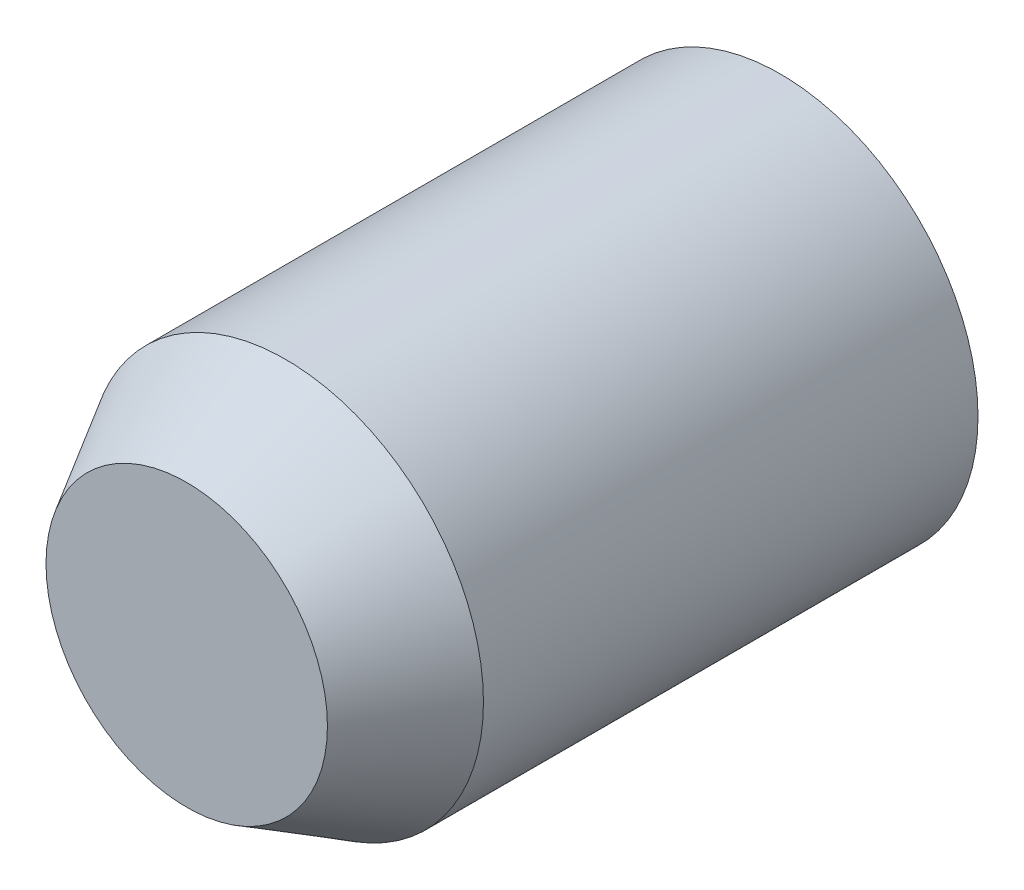
ISO-10303-21;
HEADER;
FILE_DESCRIPTION(('STEP AP214'),'2;1');
FILE_NAME('part.step','',(''),(''),'','','');
FILE_SCHEMA(('AUTOMOTIVE_DESIGN { 1 0 10303 214 1 1 1 1 }'));
ENDSEC;
DATA;
#1=APPLICATION_CONTEXT('core data for automotive mechanical design processes');
#2=APPLICATION_PROTOCOL_DEFINITION('international standard','automotive_design',2000,#1);
#3=PRODUCT_CONTEXT('',#1,'mechanical');
#4=PRODUCT('Part','Part','',(#3));
#5=PRODUCT_RELATED_PRODUCT_CATEGORY('part','',(#4));
#6=PRODUCT_DEFINITION_FORMATION('','',#4);
#7=PRODUCT_DEFINITION_CONTEXT('part definition',#1,'design');
#8=PRODUCT_DEFINITION('design','',#6,#7);
#9=PRODUCT_DEFINITION_SHAPE('','',#8);
#10=(LENGTH_UNIT() NAMED_UNIT(*) SI_UNIT(.MILLI.,.METRE.));
#11=(NAMED_UNIT(*) PLANE_ANGLE_UNIT() SI_UNIT($,.RADIAN.));
#12=(NAMED_UNIT(*) SI_UNIT($,.STERADIAN.) SOLID_ANGLE_UNIT());
#13=UNCERTAINTY_MEASURE_WITH_UNIT(LENGTH_MEASURE(1.E-05),#10,'distance_accuracy_value','');
#14=(GEOMETRIC_REPRESENTATION_CONTEXT(3) GLOBAL_UNCERTAINTY_ASSIGNED_CONTEXT((#13)) GLOBAL_UNIT_ASSIGNED_CONTEXT((#10,
#11,#12)) REPRESENTATION_CONTEXT('',''));
#15=CARTESIAN_POINT('',(0.,0.,0.));
#16=DIRECTION('',(0.,0.,1.));
#17=DIRECTION('',(1.,0.,0.));
#18=AXIS2_PLACEMENT_3D('',#15,#16,#17);
#19=CARTESIAN_POINT('',(0.,0.,3.));
#20=DIRECTION('',(0.,0.,-1.));
#21=DIRECTION('',(-1.,0.,0.));
#22=AXIS2_PLACEMENT_3D('',#19,#20,#21);
#23=CYLINDRICAL_SURFACE('',#22,1.);
#24=CARTESIAN_POINT('',(0.,0.,2.5));
#25=DIRECTION('',(0.,0.,1.));
#26=DIRECTION('',(1.,0.,0.));
#27=AXIS2_PLACEMENT_3D('',#24,#25,#26);
#28=CIRCLE('',#27,1.);
#29=CARTESIAN_POINT('',(1.,0.,2.5));
#30=VERTEX_POINT('',#29);
#31=EDGE_CURVE('E11',#30,#30,#28,.F.);
#32=ORIENTED_EDGE('',*,*,#31,.T.);
#33=EDGE_LOOP('',(#32));
#34=FACE_BOUND('',#33,.T.);
#35=CARTESIAN_POINT('',(0.,0.,0.));
#36=DIRECTION('',(0.,0.,1.));
#37=DIRECTION('',(1.,0.,0.));
#38=AXIS2_PLACEMENT_3D('',#35,#36,#37);
#39=CIRCLE('',#38,1.);
#40=CARTESIAN_POINT('',(1.,0.,0.));
#41=VERTEX_POINT('',#40);
#42=EDGE_CURVE('E139',#41,#41,#39,.T.);
#43=ORIENTED_EDGE('',*,*,#42,.T.);
#44=EDGE_LOOP('',(#43));
#45=FACE_BOUND('',#44,.T.);
#46=ADVANCED_FACE('F37',(#34,#45),#23,.T.);
#47=CARTESIAN_POINT('',(0.,0.,3.));
#48=DIRECTION('',(0.,0.,1.));
#49=DIRECTION('',(1.,0.,0.));
#50=AXIS2_PLACEMENT_3D('',#47,#48,#49);
#51=PLANE('',#50);
#52=CARTESIAN_POINT('',(0.,0.,3.));
#53=DIRECTION('',(0.,0.,1.));
#54=DIRECTION('',(1.,0.,0.));
#55=AXIS2_PLACEMENT_3D('',#52,#53,#54);
#56=CIRCLE('',#55,0.711324865405186);
#57=CARTESIAN_POINT('',(0.711324865405186,0.,3.));
#58=VERTEX_POINT('',#57);
#59=EDGE_CURVE('E45',#58,#58,#56,.T.);
#60=ORIENTED_EDGE('',*,*,#59,.T.);
#61=EDGE_LOOP('',(#60));
#62=FACE_BOUND('',#61,.T.);
#63=ADVANCED_FACE('F149',(#62),#51,.T.);
#64=CARTESIAN_POINT('',(0.,0.,0.));
#65=DIRECTION('',(0.,0.,1.));
#66=DIRECTION('',(1.,0.,0.));
#67=AXIS2_PLACEMENT_3D('',#64,#65,#66);
#68=PLANE('',#67);
#69=DIRECTION('',(0.5,0.866025403784439,0.));
#70=VECTOR('',#69,1.);
#71=CARTESIAN_POINT('',(-0.808290376865476,0.,0.));
#72=LINE('',#71,#70);
#73=CARTESIAN_POINT('',(-0.808290376865476,0.,0.));
#74=VERTEX_POINT('',#73);
#75=CARTESIAN_POINT('',(-0.404145188432738,0.700000000000001,0.));
#76=VERTEX_POINT('',#75);
#77=EDGE_CURVE('E126',#74,#76,#72,.T.);
#78=ORIENTED_EDGE('',*,*,#77,.F.);
#79=DIRECTION('',(-0.5,0.866025403784439,0.));
#80=VECTOR('',#79,1.);
#81=CARTESIAN_POINT('',(-0.404145188432738,-0.700000000000001,0.));
#82=LINE('',#81,#80);
#83=CARTESIAN_POINT('',(-0.404145188432738,-0.700000000000001,0.));
#84=VERTEX_POINT('',#83);
#85=EDGE_CURVE('E52',#84,#74,#82,.T.);
#86=ORIENTED_EDGE('',*,*,#85,.F.);
#87=DIRECTION('',(-1.,0.,0.));
#88=VECTOR('',#87,1.);
#89=CARTESIAN_POINT('',(0.404145188432738,-0.7,0.));
#90=LINE('',#89,#88);
#91=CARTESIAN_POINT('',(0.404145188432738,-0.7,0.));
#92=VERTEX_POINT('',#91);
#93=EDGE_CURVE('E135',#92,#84,#90,.T.);
#94=ORIENTED_EDGE('',*,*,#93,.F.);
#95=DIRECTION('',(-0.5,-0.866025403784439,0.));
#96=VECTOR('',#95,1.);
#97=CARTESIAN_POINT('',(0.808290376865476,0.,0.));
#98=LINE('',#97,#96);
#99=CARTESIAN_POINT('',(0.808290376865476,0.,0.));
#100=VERTEX_POINT('',#99);
#101=EDGE_CURVE('E133',#100,#92,#98,.T.);
#102=ORIENTED_EDGE('',*,*,#101,.F.);
#103=DIRECTION('',(0.5,-0.866025403784439,0.));
#104=VECTOR('',#103,1.);
#105=CARTESIAN_POINT('',(0.404145188432738,0.700000000000001,0.));
#106=LINE('',#105,#104);
#107=CARTESIAN_POINT('',(0.404145188432738,0.700000000000001,0.));
#108=VERTEX_POINT('',#107);
#109=EDGE_CURVE('E100',#108,#100,#106,.T.);
#110=ORIENTED_EDGE('',*,*,#109,.F.);
#111=DIRECTION('',(1.,0.,0.));
#112=VECTOR('',#111,1.);
#113=CARTESIAN_POINT('',(-0.404145188432738,0.700000000000001,0.));
#114=LINE('',#113,#112);
#115=EDGE_CURVE('E129',#76,#108,#114,.T.);
#116=ORIENTED_EDGE('',*,*,#115,.F.);
#117=EDGE_LOOP('',(#78,#86,#94,#102,#110,#116));
#118=FACE_BOUND('',#117,.T.);
#119=ORIENTED_EDGE('',*,*,#42,.F.);
#120=EDGE_LOOP('',(#119));
#121=FACE_BOUND('',#120,.T.);
#122=ADVANCED_FACE('F153',(#118,#121),#68,.F.);
#123=CARTESIAN_POINT('',(0.,0.,3.));
#124=DIRECTION('',(0.,0.,-1.));
#125=DIRECTION('',(-1.,0.,0.));
#126=AXIS2_PLACEMENT_3D('',#123,#124,#125);
#127=CONICAL_SURFACE('',#126,0.711324865405186,0.523598775598296);
#128=ORIENTED_EDGE('',*,*,#31,.F.);
#129=EDGE_LOOP('',(#128));
#130=FACE_BOUND('',#129,.T.);
#131=ORIENTED_EDGE('',*,*,#59,.F.);
#132=EDGE_LOOP('',(#131));
#133=FACE_BOUND('',#132,.T.);
#134=ADVANCED_FACE('F39',(#130,#133),#127,.T.);
#135=CARTESIAN_POINT('',(-0.404145188432738,-0.700000000000001,1.));
#136=DIRECTION('',(-0.866025403784439,-0.5,0.));
#137=DIRECTION('',(0.5,-0.866025403784439,0.));
#138=AXIS2_PLACEMENT_3D('',#135,#136,#137);
#139=PLANE('',#138);
#140=ORIENTED_EDGE('',*,*,#85,.T.);
#141=DIRECTION('',(0.,0.,-1.));
#142=VECTOR('',#141,1.);
#143=CARTESIAN_POINT('',(-0.808290376865476,0.,1.));
#144=LINE('',#143,#142);
#145=CARTESIAN_POINT('',(-0.808290376865476,0.,1.));
#146=VERTEX_POINT('',#145);
#147=EDGE_CURVE('E82',#146,#74,#144,.T.);
#148=ORIENTED_EDGE('',*,*,#147,.F.);
#149=DIRECTION('',(-0.5,0.866025403784439,0.));
#150=VECTOR('',#149,1.);
#151=CARTESIAN_POINT('',(-0.404145188432738,-0.700000000000001,1.));
#152=LINE('',#151,#150);
#153=CARTESIAN_POINT('',(-0.404145188432738,-0.700000000000001,1.));
#154=VERTEX_POINT('',#153);
#155=EDGE_CURVE('E137',#154,#146,#152,.T.);
#156=ORIENTED_EDGE('',*,*,#155,.F.);
#157=DIRECTION('',(0.,0.,-1.));
#158=VECTOR('',#157,1.);
#159=CARTESIAN_POINT('',(-0.404145188432738,-0.700000000000001,1.));
#160=LINE('',#159,#158);
#161=EDGE_CURVE('E60',#154,#84,#160,.T.);
#162=ORIENTED_EDGE('',*,*,#161,.T.);
#163=EDGE_LOOP('',(#140,#148,#156,#162));
#164=FACE_BOUND('',#163,.T.);
#165=ADVANCED_FACE('F152',(#164),#139,.F.);
#166=CARTESIAN_POINT('',(0.404145188432738,-0.7,1.));
#167=DIRECTION('',(0.,-1.,0.));
#168=DIRECTION('',(1.,0.,0.));
#169=AXIS2_PLACEMENT_3D('',#166,#167,#168);
#170=PLANE('',#169);
#171=ORIENTED_EDGE('',*,*,#93,.T.);
#172=ORIENTED_EDGE('',*,*,#161,.F.);
#173=DIRECTION('',(-1.,0.,0.));
#174=VECTOR('',#173,1.);
#175=CARTESIAN_POINT('',(0.404145188432738,-0.7,1.));
#176=LINE('',#175,#174);
#177=CARTESIAN_POINT('',(0.404145188432738,-0.7,1.));
#178=VERTEX_POINT('',#177);
#179=EDGE_CURVE('E112',#178,#154,#176,.T.);
#180=ORIENTED_EDGE('',*,*,#179,.F.);
#181=DIRECTION('',(0.,0.,-1.));
#182=VECTOR('',#181,1.);
#183=CARTESIAN_POINT('',(0.404145188432738,-0.7,1.));
#184=LINE('',#183,#182);
#185=EDGE_CURVE('E104',#178,#92,#184,.T.);
#186=ORIENTED_EDGE('',*,*,#185,.T.);
#187=EDGE_LOOP('',(#171,#172,#180,#186));
#188=FACE_BOUND('',#187,.T.);
#189=ADVANCED_FACE('F160',(#188),#170,.F.);
#190=CARTESIAN_POINT('',(0.808290376865476,0.,1.));
#191=DIRECTION('',(0.866025403784439,-0.5,0.));
#192=DIRECTION('',(0.5,0.866025403784439,0.));
#193=AXIS2_PLACEMENT_3D('',#190,#191,#192);
#194=PLANE('',#193);
#195=ORIENTED_EDGE('',*,*,#101,.T.);
#196=ORIENTED_EDGE('',*,*,#185,.F.);
#197=DIRECTION('',(-0.5,-0.866025403784439,0.));
#198=VECTOR('',#197,1.);
#199=CARTESIAN_POINT('',(0.808290376865476,0.,1.));
#200=LINE('',#199,#198);
#201=CARTESIAN_POINT('',(0.808290376865476,0.,1.));
#202=VERTEX_POINT('',#201);
#203=EDGE_CURVE('E108',#202,#178,#200,.T.);
#204=ORIENTED_EDGE('',*,*,#203,.F.);
#205=DIRECTION('',(0.,0.,-1.));
#206=VECTOR('',#205,1.);
#207=CARTESIAN_POINT('',(0.808290376865476,0.,1.));
#208=LINE('',#207,#206);
#209=EDGE_CURVE('E93',#202,#100,#208,.T.);
#210=ORIENTED_EDGE('',*,*,#209,.T.);
#211=EDGE_LOOP('',(#195,#196,#204,#210));
#212=FACE_BOUND('',#211,.T.);
#213=ADVANCED_FACE('F109',(#212),#194,.F.);
#214=CARTESIAN_POINT('',(0.404145188432738,0.700000000000001,1.));
#215=DIRECTION('',(0.866025403784439,0.5,0.));
#216=DIRECTION('',(-0.5,0.866025403784439,0.));
#217=AXIS2_PLACEMENT_3D('',#214,#215,#216);
#218=PLANE('',#217);
#219=ORIENTED_EDGE('',*,*,#109,.T.);
#220=ORIENTED_EDGE('',*,*,#209,.F.);
#221=DIRECTION('',(0.5,-0.866025403784439,0.));
#222=VECTOR('',#221,1.);
#223=CARTESIAN_POINT('',(0.404145188432738,0.700000000000001,1.));
#224=LINE('',#223,#222);
#225=CARTESIAN_POINT('',(0.404145188432738,0.700000000000001,1.));
#226=VERTEX_POINT('',#225);
#227=EDGE_CURVE('E97',#226,#202,#224,.T.);
#228=ORIENTED_EDGE('',*,*,#227,.F.);
#229=DIRECTION('',(0.,0.,-1.));
#230=VECTOR('',#229,1.);
#231=CARTESIAN_POINT('',(0.404145188432738,0.700000000000001,1.));
#232=LINE('',#231,#230);
#233=EDGE_CURVE('E105',#226,#108,#232,.T.);
#234=ORIENTED_EDGE('',*,*,#233,.T.);
#235=EDGE_LOOP('',(#219,#220,#228,#234));
#236=FACE_BOUND('',#235,.T.);
#237=ADVANCED_FACE('F95',(#236),#218,.F.);
#238=CARTESIAN_POINT('',(-0.404145188432738,0.700000000000001,1.));
#239=DIRECTION('',(0.,1.,0.));
#240=DIRECTION('',(-1.,0.,0.));
#241=AXIS2_PLACEMENT_3D('',#238,#239,#240);
#242=PLANE('',#241);
#243=ORIENTED_EDGE('',*,*,#115,.T.);
#244=ORIENTED_EDGE('',*,*,#233,.F.);
#245=DIRECTION('',(1.,0.,0.));
#246=VECTOR('',#245,1.);
#247=CARTESIAN_POINT('',(-0.404145188432738,0.700000000000001,1.));
#248=LINE('',#247,#246);
#249=CARTESIAN_POINT('',(-0.404145188432738,0.700000000000001,1.));
#250=VERTEX_POINT('',#249);
#251=EDGE_CURVE('E118',#250,#226,#248,.T.);
#252=ORIENTED_EDGE('',*,*,#251,.F.);
#253=DIRECTION('',(0.,0.,-1.));
#254=VECTOR('',#253,1.);
#255=CARTESIAN_POINT('',(-0.404145188432738,0.700000000000001,1.));
#256=LINE('',#255,#254);
#257=EDGE_CURVE('E142',#250,#76,#256,.T.);
#258=ORIENTED_EDGE('',*,*,#257,.T.);
#259=EDGE_LOOP('',(#243,#244,#252,#258));
#260=FACE_BOUND('',#259,.T.);
#261=ADVANCED_FACE('F175',(#260),#242,.F.);
#262=CARTESIAN_POINT('',(-0.808290376865476,0.,1.));
#263=DIRECTION('',(-0.866025403784439,0.5,0.));
#264=DIRECTION('',(-0.5,-0.866025403784439,0.));
#265=AXIS2_PLACEMENT_3D('',#262,#263,#264);
#266=PLANE('',#265);
#267=ORIENTED_EDGE('',*,*,#77,.T.);
#268=ORIENTED_EDGE('',*,*,#257,.F.);
#269=DIRECTION('',(0.5,0.866025403784439,0.));
#270=VECTOR('',#269,1.);
#271=CARTESIAN_POINT('',(-0.808290376865476,0.,1.));
#272=LINE('',#271,#270);
#273=EDGE_CURVE('E120',#146,#250,#272,.T.);
#274=ORIENTED_EDGE('',*,*,#273,.F.);
#275=ORIENTED_EDGE('',*,*,#147,.T.);
#276=EDGE_LOOP('',(#267,#268,#274,#275));
#277=FACE_BOUND('',#276,.T.);
#278=ADVANCED_FACE('F172',(#277),#266,.F.);
#279=CARTESIAN_POINT('',(0.,0.,1.));
#280=DIRECTION('',(0.,0.,-1.));
#281=DIRECTION('',(-1.,0.,0.));
#282=AXIS2_PLACEMENT_3D('',#279,#280,#281);
#283=PLANE('',#282);
#284=ORIENTED_EDGE('',*,*,#155,.T.);
#285=ORIENTED_EDGE('',*,*,#273,.T.);
#286=ORIENTED_EDGE('',*,*,#251,.T.);
#287=ORIENTED_EDGE('',*,*,#227,.T.);
#288=ORIENTED_EDGE('',*,*,#203,.T.);
#289=ORIENTED_EDGE('',*,*,#179,.T.);
#290=EDGE_LOOP('',(#284,#285,#286,#287,#288,#289));
#291=FACE_BOUND('',#290,.T.);
#292=ADVANCED_FACE('F115',(#291),#283,.T.);
#293=CLOSED_SHELL('',(#46,#63,#122,#134,#165,#189,#213,#237,#261,#278,#292));
#294=MANIFOLD_SOLID_BREP('B2',#293);
#295=ADVANCED_BREP_SHAPE_REPRESENTATION('',(#18,#294),#14);
#296=SHAPE_DEFINITION_REPRESENTATION(#9,#295);
ENDSEC;
END-ISO-10303-21;
